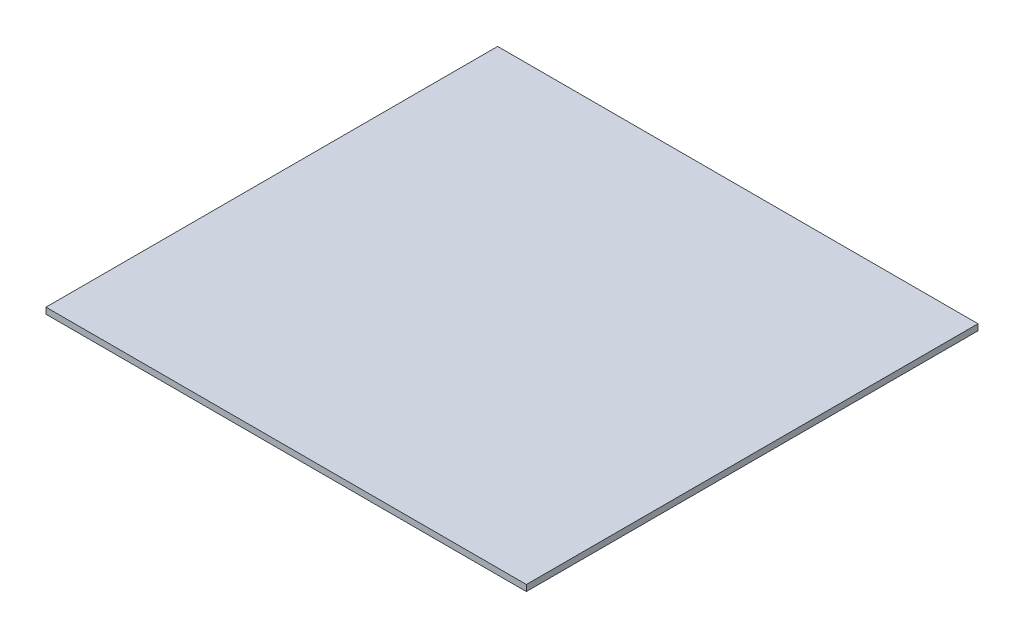
ISO-10303-21;
HEADER;
FILE_DESCRIPTION(('STEP AP214'),'2;1');
FILE_NAME('part.step','',(''),(''),'','','');
FILE_SCHEMA(('AUTOMOTIVE_DESIGN { 1 0 10303 214 1 1 1 1 }'));
ENDSEC;
DATA;
#1=APPLICATION_CONTEXT('core data for automotive mechanical design processes');
#2=APPLICATION_PROTOCOL_DEFINITION('international standard','automotive_design',2000,#1);
#3=PRODUCT_CONTEXT('',#1,'mechanical');
#4=PRODUCT('Part','Part','',(#3));
#5=PRODUCT_RELATED_PRODUCT_CATEGORY('part','',(#4));
#6=PRODUCT_DEFINITION_FORMATION('','',#4);
#7=PRODUCT_DEFINITION_CONTEXT('part definition',#1,'design');
#8=PRODUCT_DEFINITION('design','',#6,#7);
#9=PRODUCT_DEFINITION_SHAPE('','',#8);
#10=(LENGTH_UNIT() NAMED_UNIT(*) SI_UNIT(.MILLI.,.METRE.));
#11=(NAMED_UNIT(*) PLANE_ANGLE_UNIT() SI_UNIT($,.RADIAN.));
#12=(NAMED_UNIT(*) SI_UNIT($,.STERADIAN.) SOLID_ANGLE_UNIT());
#13=UNCERTAINTY_MEASURE_WITH_UNIT(LENGTH_MEASURE(1.E-05),#10,'distance_accuracy_value','');
#14=(GEOMETRIC_REPRESENTATION_CONTEXT(3) GLOBAL_UNCERTAINTY_ASSIGNED_CONTEXT((#13)) GLOBAL_UNIT_ASSIGNED_CONTEXT((#10,
#11,#12)) REPRESENTATION_CONTEXT('',''));
#15=CARTESIAN_POINT('',(0.,0.,0.));
#16=DIRECTION('',(0.,0.,1.));
#17=DIRECTION('',(1.,0.,0.));
#18=AXIS2_PLACEMENT_3D('',#15,#16,#17);
#19=CARTESIAN_POINT('',(58.5,1.5,-55.));
#20=DIRECTION('',(-1.,0.,0.));
#21=DIRECTION('',(0.,0.,1.));
#22=AXIS2_PLACEMENT_3D('',#19,#20,#21);
#23=PLANE('',#22);
#24=DIRECTION('',(0.,0.,-1.));
#25=VECTOR('',#24,1.);
#26=CARTESIAN_POINT('',(58.5,0.,-55.));
#27=LINE('',#26,#25);
#28=CARTESIAN_POINT('',(58.5,0.,55.));
#29=VERTEX_POINT('',#28);
#30=CARTESIAN_POINT('',(58.5,0.,-55.));
#31=VERTEX_POINT('',#30);
#32=EDGE_CURVE('E107',#29,#31,#27,.T.);
#33=ORIENTED_EDGE('',*,*,#32,.T.);
#34=DIRECTION('',(0.,-1.,0.));
#35=VECTOR('',#34,1.);
#36=CARTESIAN_POINT('',(58.5,1.5,-55.));
#37=LINE('',#36,#35);
#38=CARTESIAN_POINT('',(58.5,1.5,-55.));
#39=VERTEX_POINT('',#38);
#40=EDGE_CURVE('E11',#39,#31,#37,.T.);
#41=ORIENTED_EDGE('',*,*,#40,.F.);
#42=DIRECTION('',(0.,0.,-1.));
#43=VECTOR('',#42,1.);
#44=CARTESIAN_POINT('',(58.5,1.5,-55.));
#45=LINE('',#44,#43);
#46=CARTESIAN_POINT('',(58.5,1.5,55.));
#47=VERTEX_POINT('',#46);
#48=EDGE_CURVE('E91',#47,#39,#45,.T.);
#49=ORIENTED_EDGE('',*,*,#48,.F.);
#50=DIRECTION('',(0.,-1.,0.));
#51=VECTOR('',#50,1.);
#52=CARTESIAN_POINT('',(58.5,1.5,55.));
#53=LINE('',#52,#51);
#54=EDGE_CURVE('E103',#47,#29,#53,.T.);
#55=ORIENTED_EDGE('',*,*,#54,.T.);
#56=EDGE_LOOP('',(#33,#41,#49,#55));
#57=FACE_BOUND('',#56,.T.);
#58=ADVANCED_FACE('F39',(#57),#23,.F.);
#59=CARTESIAN_POINT('',(-58.5,1.5,-55.));
#60=DIRECTION('',(0.,0.,1.));
#61=DIRECTION('',(1.,0.,0.));
#62=AXIS2_PLACEMENT_3D('',#59,#60,#61);
#63=PLANE('',#62);
#64=DIRECTION('',(-1.,0.,0.));
#65=VECTOR('',#64,1.);
#66=CARTESIAN_POINT('',(-58.5,0.,-55.));
#67=LINE('',#66,#65);
#68=CARTESIAN_POINT('',(-58.5,0.,-55.));
#69=VERTEX_POINT('',#68);
#70=EDGE_CURVE('E96',#31,#69,#67,.T.);
#71=ORIENTED_EDGE('',*,*,#70,.T.);
#72=DIRECTION('',(0.,-1.,0.));
#73=VECTOR('',#72,1.);
#74=CARTESIAN_POINT('',(-58.5,1.5,-55.));
#75=LINE('',#74,#73);
#76=CARTESIAN_POINT('',(-58.5,1.5,-55.));
#77=VERTEX_POINT('',#76);
#78=EDGE_CURVE('E48',#77,#69,#75,.T.);
#79=ORIENTED_EDGE('',*,*,#78,.F.);
#80=DIRECTION('',(-1.,0.,0.));
#81=VECTOR('',#80,1.);
#82=CARTESIAN_POINT('',(-58.5,1.5,-55.));
#83=LINE('',#82,#81);
#84=EDGE_CURVE('E86',#39,#77,#83,.T.);
#85=ORIENTED_EDGE('',*,*,#84,.F.);
#86=ORIENTED_EDGE('',*,*,#40,.T.);
#87=EDGE_LOOP('',(#71,#79,#85,#86));
#88=FACE_BOUND('',#87,.T.);
#89=ADVANCED_FACE('F95',(#88),#63,.F.);
#90=CARTESIAN_POINT('',(-58.5,1.5,-55.));
#91=DIRECTION('',(1.,0.,0.));
#92=DIRECTION('',(0.,0.,-1.));
#93=AXIS2_PLACEMENT_3D('',#90,#91,#92);
#94=PLANE('',#93);
#95=DIRECTION('',(0.,0.,1.));
#96=VECTOR('',#95,1.);
#97=CARTESIAN_POINT('',(-58.5,0.,-55.));
#98=LINE('',#97,#96);
#99=CARTESIAN_POINT('',(-58.5,0.,55.));
#100=VERTEX_POINT('',#99);
#101=EDGE_CURVE('E73',#69,#100,#98,.T.);
#102=ORIENTED_EDGE('',*,*,#101,.T.);
#103=DIRECTION('',(0.,-1.,0.));
#104=VECTOR('',#103,1.);
#105=CARTESIAN_POINT('',(-58.5,1.5,55.));
#106=LINE('',#105,#104);
#107=CARTESIAN_POINT('',(-58.5,1.5,55.));
#108=VERTEX_POINT('',#107);
#109=EDGE_CURVE('E98',#108,#100,#106,.T.);
#110=ORIENTED_EDGE('',*,*,#109,.F.);
#111=DIRECTION('',(0.,0.,1.));
#112=VECTOR('',#111,1.);
#113=CARTESIAN_POINT('',(-58.5,1.5,-55.));
#114=LINE('',#113,#112);
#115=EDGE_CURVE('E89',#77,#108,#114,.T.);
#116=ORIENTED_EDGE('',*,*,#115,.F.);
#117=ORIENTED_EDGE('',*,*,#78,.T.);
#118=EDGE_LOOP('',(#102,#110,#116,#117));
#119=FACE_BOUND('',#118,.T.);
#120=ADVANCED_FACE('F99',(#119),#94,.F.);
#121=CARTESIAN_POINT('',(-58.5,1.5,55.));
#122=DIRECTION('',(0.,0.,-1.));
#123=DIRECTION('',(-1.,0.,0.));
#124=AXIS2_PLACEMENT_3D('',#121,#122,#123);
#125=PLANE('',#124);
#126=DIRECTION('',(1.,0.,0.));
#127=VECTOR('',#126,1.);
#128=CARTESIAN_POINT('',(-58.5,0.,55.));
#129=LINE('',#128,#127);
#130=EDGE_CURVE('E79',#100,#29,#129,.T.);
#131=ORIENTED_EDGE('',*,*,#130,.T.);
#132=ORIENTED_EDGE('',*,*,#54,.F.);
#133=DIRECTION('',(1.,0.,0.));
#134=VECTOR('',#133,1.);
#135=CARTESIAN_POINT('',(-58.5,1.5,55.));
#136=LINE('',#135,#134);
#137=EDGE_CURVE('E56',#108,#47,#136,.T.);
#138=ORIENTED_EDGE('',*,*,#137,.F.);
#139=ORIENTED_EDGE('',*,*,#109,.T.);
#140=EDGE_LOOP('',(#131,#132,#138,#139));
#141=FACE_BOUND('',#140,.T.);
#142=ADVANCED_FACE('F120',(#141),#125,.F.);
#143=CARTESIAN_POINT('',(0.,1.5,0.));
#144=DIRECTION('',(0.,1.,0.));
#145=DIRECTION('',(0.,0.,1.));
#146=AXIS2_PLACEMENT_3D('',#143,#144,#145);
#147=PLANE('',#146);
#148=ORIENTED_EDGE('',*,*,#48,.T.);
#149=ORIENTED_EDGE('',*,*,#84,.T.);
#150=ORIENTED_EDGE('',*,*,#115,.T.);
#151=ORIENTED_EDGE('',*,*,#137,.T.);
#152=EDGE_LOOP('',(#148,#149,#150,#151));
#153=FACE_BOUND('',#152,.T.);
#154=ADVANCED_FACE('F87',(#153),#147,.T.);
#155=CARTESIAN_POINT('',(0.,0.,0.));
#156=DIRECTION('',(0.,1.,0.));
#157=DIRECTION('',(0.,0.,1.));
#158=AXIS2_PLACEMENT_3D('',#155,#156,#157);
#159=PLANE('',#158);
#160=ORIENTED_EDGE('',*,*,#32,.F.);
#161=ORIENTED_EDGE('',*,*,#130,.F.);
#162=ORIENTED_EDGE('',*,*,#101,.F.);
#163=ORIENTED_EDGE('',*,*,#70,.F.);
#164=EDGE_LOOP('',(#160,#161,#162,#163));
#165=FACE_BOUND('',#164,.T.);
#166=ADVANCED_FACE('F123',(#165),#159,.F.);
#167=CLOSED_SHELL('',(#58,#89,#120,#142,#154,#166));
#168=MANIFOLD_SOLID_BREP('B2',#167);
#169=ADVANCED_BREP_SHAPE_REPRESENTATION('',(#18,#168),#14);
#170=SHAPE_DEFINITION_REPRESENTATION(#9,#169);
ENDSEC;
END-ISO-10303-21;
